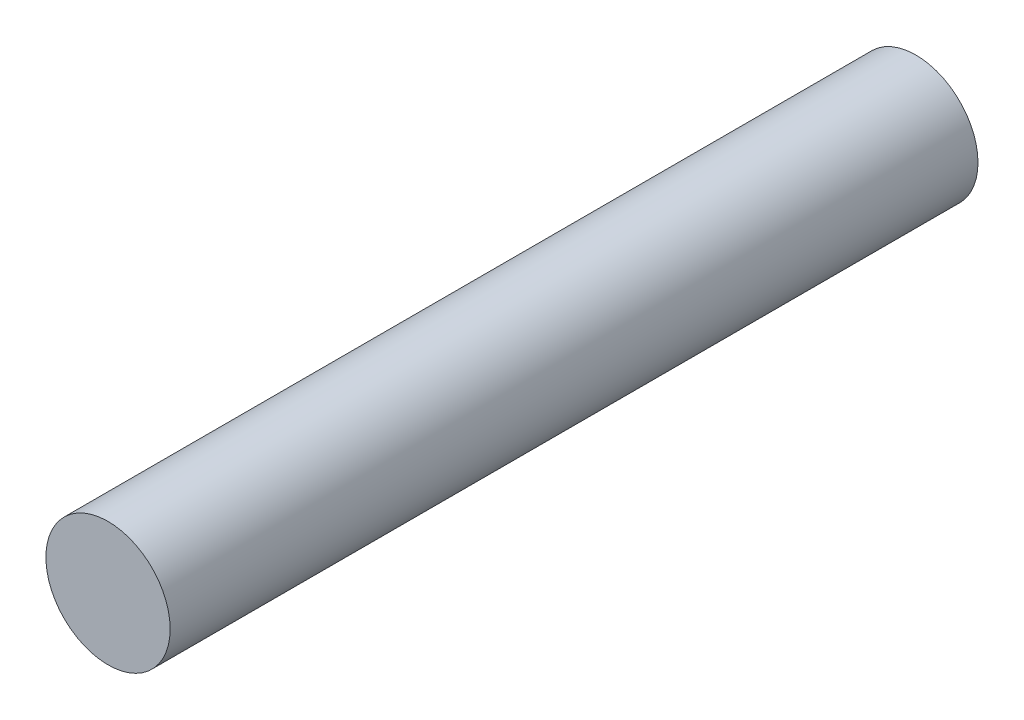
ISO-10303-21;
HEADER;
FILE_DESCRIPTION(('STEP AP214'),'2;1');
FILE_NAME('part.step','',(''),(''),'','','');
FILE_SCHEMA(('AUTOMOTIVE_DESIGN { 1 0 10303 214 1 1 1 1 }'));
ENDSEC;
DATA;
#1=APPLICATION_CONTEXT('core data for automotive mechanical design processes');
#2=APPLICATION_PROTOCOL_DEFINITION('international standard','automotive_design',2000,#1);
#3=PRODUCT_CONTEXT('',#1,'mechanical');
#4=PRODUCT('Part','Part','',(#3));
#5=PRODUCT_RELATED_PRODUCT_CATEGORY('part','',(#4));
#6=PRODUCT_DEFINITION_FORMATION('','',#4);
#7=PRODUCT_DEFINITION_CONTEXT('part definition',#1,'design');
#8=PRODUCT_DEFINITION('design','',#6,#7);
#9=PRODUCT_DEFINITION_SHAPE('','',#8);
#10=(LENGTH_UNIT() NAMED_UNIT(*) SI_UNIT(.MILLI.,.METRE.));
#11=(NAMED_UNIT(*) PLANE_ANGLE_UNIT() SI_UNIT($,.RADIAN.));
#12=(NAMED_UNIT(*) SI_UNIT($,.STERADIAN.) SOLID_ANGLE_UNIT());
#13=UNCERTAINTY_MEASURE_WITH_UNIT(LENGTH_MEASURE(1.E-05),#10,'distance_accuracy_value','');
#14=(GEOMETRIC_REPRESENTATION_CONTEXT(3) GLOBAL_UNCERTAINTY_ASSIGNED_CONTEXT((#13)) GLOBAL_UNIT_ASSIGNED_CONTEXT((#10,
#11,#12)) REPRESENTATION_CONTEXT('',''));
#15=CARTESIAN_POINT('',(0.,0.,0.));
#16=DIRECTION('',(0.,0.,1.));
#17=DIRECTION('',(1.,0.,0.));
#18=AXIS2_PLACEMENT_3D('',#15,#16,#17);
#19=CARTESIAN_POINT('',(0.,0.,65.));
#20=DIRECTION('',(0.,0.,-1.));
#21=DIRECTION('',(-1.,0.,0.));
#22=AXIS2_PLACEMENT_3D('',#19,#20,#21);
#23=CYLINDRICAL_SURFACE('',#22,5.);
#24=CARTESIAN_POINT('',(0.,0.,65.));
#25=DIRECTION('',(0.,0.,1.));
#26=DIRECTION('',(1.,0.,0.));
#27=AXIS2_PLACEMENT_3D('',#24,#25,#26);
#28=CIRCLE('',#27,5.);
#29=CARTESIAN_POINT('',(5.,0.,65.));
#30=VERTEX_POINT('',#29);
#31=EDGE_CURVE('E12',#30,#30,#28,.T.);
#32=ORIENTED_EDGE('',*,*,#31,.F.);
#33=EDGE_LOOP('',(#32));
#34=FACE_BOUND('',#33,.T.);
#35=CARTESIAN_POINT('',(0.,0.,0.));
#36=DIRECTION('',(0.,0.,1.));
#37=DIRECTION('',(1.,0.,0.));
#38=AXIS2_PLACEMENT_3D('',#35,#36,#37);
#39=CIRCLE('',#38,5.);
#40=CARTESIAN_POINT('',(5.,0.,0.));
#41=VERTEX_POINT('',#40);
#42=EDGE_CURVE('E43',#41,#41,#39,.T.);
#43=ORIENTED_EDGE('',*,*,#42,.T.);
#44=EDGE_LOOP('',(#43));
#45=FACE_BOUND('',#44,.T.);
#46=ADVANCED_FACE('F40',(#34,#45),#23,.T.);
#47=CARTESIAN_POINT('',(0.,0.,65.));
#48=DIRECTION('',(0.,0.,1.));
#49=DIRECTION('',(1.,0.,0.));
#50=AXIS2_PLACEMENT_3D('',#47,#48,#49);
#51=PLANE('',#50);
#52=ORIENTED_EDGE('',*,*,#31,.T.);
#53=EDGE_LOOP('',(#52));
#54=FACE_BOUND('',#53,.T.);
#55=ADVANCED_FACE('F55',(#54),#51,.T.);
#56=CARTESIAN_POINT('',(0.,0.,0.));
#57=DIRECTION('',(0.,0.,1.));
#58=DIRECTION('',(1.,0.,0.));
#59=AXIS2_PLACEMENT_3D('',#56,#57,#58);
#60=PLANE('',#59);
#61=ORIENTED_EDGE('',*,*,#42,.F.);
#62=EDGE_LOOP('',(#61));
#63=FACE_BOUND('',#62,.T.);
#64=ADVANCED_FACE('F53',(#63),#60,.F.);
#65=CLOSED_SHELL('',(#46,#55,#64));
#66=MANIFOLD_SOLID_BREP('B2',#65);
#67=ADVANCED_BREP_SHAPE_REPRESENTATION('',(#18,#66),#14);
#68=SHAPE_DEFINITION_REPRESENTATION(#9,#67);
ENDSEC;
END-ISO-10303-21;
